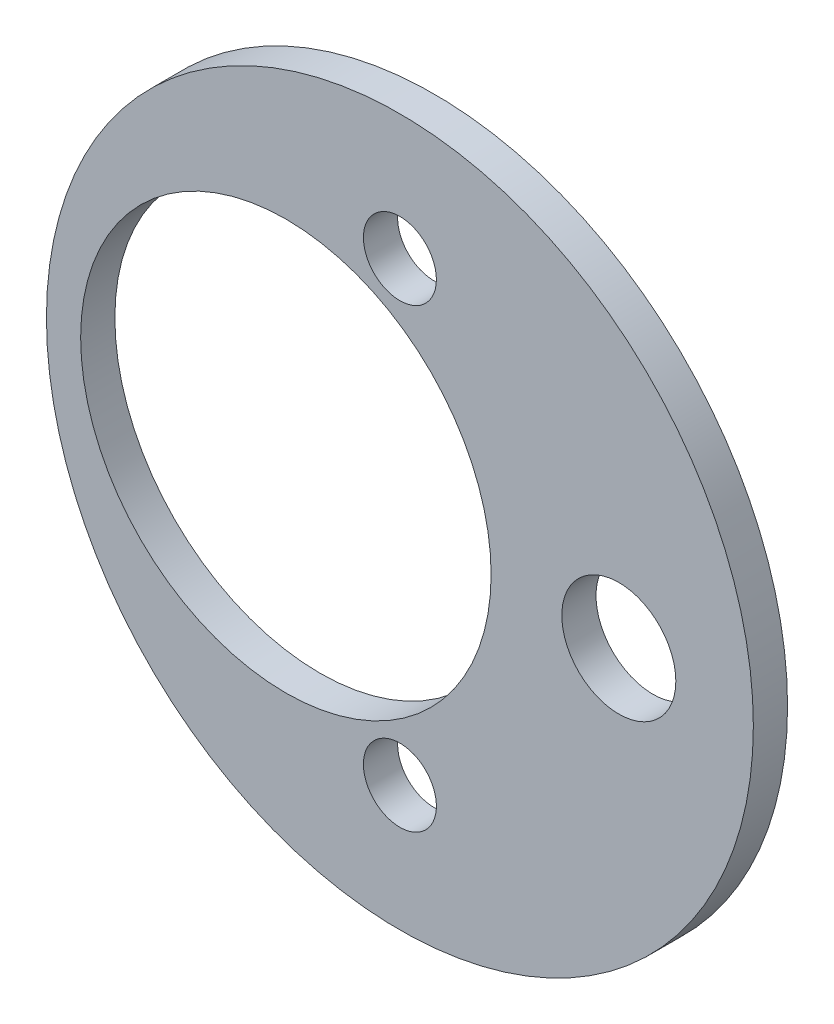
ISO-10303-21;
HEADER;
FILE_DESCRIPTION(('STEP AP214'),'2;1');
FILE_NAME('part.step','',(''),(''),'','','');
FILE_SCHEMA(('AUTOMOTIVE_DESIGN { 1 0 10303 214 1 1 1 1 }'));
ENDSEC;
DATA;
#1=APPLICATION_CONTEXT('core data for automotive mechanical design processes');
#2=APPLICATION_PROTOCOL_DEFINITION('international standard','automotive_design',2000,#1);
#3=PRODUCT_CONTEXT('',#1,'mechanical');
#4=PRODUCT('Part','Part','',(#3));
#5=PRODUCT_RELATED_PRODUCT_CATEGORY('part','',(#4));
#6=PRODUCT_DEFINITION_FORMATION('','',#4);
#7=PRODUCT_DEFINITION_CONTEXT('part definition',#1,'design');
#8=PRODUCT_DEFINITION('design','',#6,#7);
#9=PRODUCT_DEFINITION_SHAPE('','',#8);
#10=(LENGTH_UNIT() NAMED_UNIT(*) SI_UNIT(.MILLI.,.METRE.));
#11=(NAMED_UNIT(*) PLANE_ANGLE_UNIT() SI_UNIT($,.RADIAN.));
#12=(NAMED_UNIT(*) SI_UNIT($,.STERADIAN.) SOLID_ANGLE_UNIT());
#13=UNCERTAINTY_MEASURE_WITH_UNIT(LENGTH_MEASURE(1.E-05),#10,'distance_accuracy_value','');
#14=(GEOMETRIC_REPRESENTATION_CONTEXT(3) GLOBAL_UNCERTAINTY_ASSIGNED_CONTEXT((#13)) GLOBAL_UNIT_ASSIGNED_CONTEXT((#10,
#11,#12)) REPRESENTATION_CONTEXT('',''));
#15=CARTESIAN_POINT('',(0.,0.,0.));
#16=DIRECTION('',(0.,0.,1.));
#17=DIRECTION('',(1.,0.,0.));
#18=AXIS2_PLACEMENT_3D('',#15,#16,#17);
#19=CARTESIAN_POINT('',(0.,0.,1.5));
#20=DIRECTION('',(0.,0.,1.));
#21=DIRECTION('',(1.,0.,0.));
#22=AXIS2_PLACEMENT_3D('',#19,#20,#21);
#23=PLANE('',#22);
#24=CARTESIAN_POINT('',(0.,10.,1.5));
#25=DIRECTION('',(0.,0.,1.));
#26=DIRECTION('',(1.,0.,0.));
#27=AXIS2_PLACEMENT_3D('',#24,#25,#26);
#28=CIRCLE('',#27,1.6);
#29=CARTESIAN_POINT('',(1.6,10.,1.5));
#30=VERTEX_POINT('',#29);
#31=EDGE_CURVE('E59',#30,#30,#28,.T.);
#32=ORIENTED_EDGE('',*,*,#31,.F.);
#33=EDGE_LOOP('',(#32));
#34=FACE_BOUND('',#33,.T.);
#35=CARTESIAN_POINT('',(-5.,0.,1.5));
#36=DIRECTION('',(0.,0.,1.));
#37=DIRECTION('',(1.,0.,0.));
#38=AXIS2_PLACEMENT_3D('',#35,#36,#37);
#39=CIRCLE('',#38,9.);
#40=CARTESIAN_POINT('',(4.,0.,1.5));
#41=VERTEX_POINT('',#40);
#42=EDGE_CURVE('E48',#41,#41,#39,.T.);
#43=ORIENTED_EDGE('',*,*,#42,.F.);
#44=EDGE_LOOP('',(#43));
#45=FACE_BOUND('',#44,.T.);
#46=CARTESIAN_POINT('',(0.,0.,1.5));
#47=DIRECTION('',(0.,0.,1.));
#48=DIRECTION('',(1.,0.,0.));
#49=AXIS2_PLACEMENT_3D('',#46,#47,#48);
#50=CIRCLE('',#49,15.5);
#51=CARTESIAN_POINT('',(15.5,0.,1.5));
#52=VERTEX_POINT('',#51);
#53=EDGE_CURVE('E10',#52,#52,#50,.T.);
#54=ORIENTED_EDGE('',*,*,#53,.T.);
#55=EDGE_LOOP('',(#54));
#56=FACE_BOUND('',#55,.T.);
#57=CARTESIAN_POINT('',(9.6,0.,1.5));
#58=DIRECTION('',(0.,0.,1.));
#59=DIRECTION('',(1.,0.,0.));
#60=AXIS2_PLACEMENT_3D('',#57,#58,#59);
#61=CIRCLE('',#60,2.5);
#62=CARTESIAN_POINT('',(12.1,0.,1.5));
#63=VERTEX_POINT('',#62);
#64=EDGE_CURVE('E53',#63,#63,#61,.T.);
#65=ORIENTED_EDGE('',*,*,#64,.F.);
#66=EDGE_LOOP('',(#65));
#67=FACE_BOUND('',#66,.T.);
#68=CARTESIAN_POINT('',(0.,-10.,1.5));
#69=DIRECTION('',(0.,0.,1.));
#70=DIRECTION('',(-1.,0.,0.));
#71=AXIS2_PLACEMENT_3D('',#68,#69,#70);
#72=CIRCLE('',#71,1.6);
#73=CARTESIAN_POINT('',(-1.6,-10.,1.5));
#74=VERTEX_POINT('',#73);
#75=EDGE_CURVE('E65',#74,#74,#72,.T.);
#76=ORIENTED_EDGE('',*,*,#75,.F.);
#77=EDGE_LOOP('',(#76));
#78=FACE_BOUND('',#77,.T.);
#79=ADVANCED_FACE('F37',(#34,#45,#56,#67,#78),#23,.T.);
#80=CARTESIAN_POINT('',(0.,0.,0.));
#81=DIRECTION('',(0.,0.,1.));
#82=DIRECTION('',(1.,0.,0.));
#83=AXIS2_PLACEMENT_3D('',#80,#81,#82);
#84=PLANE('',#83);
#85=CARTESIAN_POINT('',(0.,0.,0.));
#86=DIRECTION('',(0.,0.,1.));
#87=DIRECTION('',(1.,0.,0.));
#88=AXIS2_PLACEMENT_3D('',#85,#86,#87);
#89=CIRCLE('',#88,15.5);
#90=CARTESIAN_POINT('',(15.5,0.,0.));
#91=VERTEX_POINT('',#90);
#92=EDGE_CURVE('E41',#91,#91,#89,.T.);
#93=ORIENTED_EDGE('',*,*,#92,.F.);
#94=EDGE_LOOP('',(#93));
#95=FACE_BOUND('',#94,.T.);
#96=CARTESIAN_POINT('',(-5.,0.,0.));
#97=DIRECTION('',(0.,0.,1.));
#98=DIRECTION('',(1.,0.,0.));
#99=AXIS2_PLACEMENT_3D('',#96,#97,#98);
#100=CIRCLE('',#99,9.);
#101=CARTESIAN_POINT('',(4.,0.,0.));
#102=VERTEX_POINT('',#101);
#103=EDGE_CURVE('E50',#102,#102,#100,.T.);
#104=ORIENTED_EDGE('',*,*,#103,.T.);
#105=EDGE_LOOP('',(#104));
#106=FACE_BOUND('',#105,.T.);
#107=CARTESIAN_POINT('',(9.6,0.,0.));
#108=DIRECTION('',(0.,0.,1.));
#109=DIRECTION('',(1.,0.,0.));
#110=AXIS2_PLACEMENT_3D('',#107,#108,#109);
#111=CIRCLE('',#110,2.5);
#112=CARTESIAN_POINT('',(12.1,0.,0.));
#113=VERTEX_POINT('',#112);
#114=EDGE_CURVE('E56',#113,#113,#111,.T.);
#115=ORIENTED_EDGE('',*,*,#114,.T.);
#116=EDGE_LOOP('',(#115));
#117=FACE_BOUND('',#116,.T.);
#118=CARTESIAN_POINT('',(0.,10.,0.));
#119=DIRECTION('',(0.,0.,1.));
#120=DIRECTION('',(1.,0.,0.));
#121=AXIS2_PLACEMENT_3D('',#118,#119,#120);
#122=CIRCLE('',#121,1.6);
#123=CARTESIAN_POINT('',(1.6,10.,0.));
#124=VERTEX_POINT('',#123);
#125=EDGE_CURVE('E62',#124,#124,#122,.T.);
#126=ORIENTED_EDGE('',*,*,#125,.T.);
#127=EDGE_LOOP('',(#126));
#128=FACE_BOUND('',#127,.T.);
#129=CARTESIAN_POINT('',(0.,-10.,0.));
#130=DIRECTION('',(0.,0.,1.));
#131=DIRECTION('',(-1.,0.,0.));
#132=AXIS2_PLACEMENT_3D('',#129,#130,#131);
#133=CIRCLE('',#132,1.6);
#134=CARTESIAN_POINT('',(-1.6,-10.,0.));
#135=VERTEX_POINT('',#134);
#136=EDGE_CURVE('E68',#135,#135,#133,.T.);
#137=ORIENTED_EDGE('',*,*,#136,.T.);
#138=EDGE_LOOP('',(#137));
#139=FACE_BOUND('',#138,.T.);
#140=ADVANCED_FACE('F78',(#95,#106,#117,#128,#139),#84,.F.);
#141=CARTESIAN_POINT('',(0.,0.,1.5));
#142=DIRECTION('',(0.,0.,-1.));
#143=DIRECTION('',(-1.,0.,0.));
#144=AXIS2_PLACEMENT_3D('',#141,#142,#143);
#145=CYLINDRICAL_SURFACE('',#144,15.5);
#146=ORIENTED_EDGE('',*,*,#53,.F.);
#147=EDGE_LOOP('',(#146));
#148=FACE_BOUND('',#147,.T.);
#149=ORIENTED_EDGE('',*,*,#92,.T.);
#150=EDGE_LOOP('',(#149));
#151=FACE_BOUND('',#150,.T.);
#152=ADVANCED_FACE('F39',(#148,#151),#145,.T.);
#153=CARTESIAN_POINT('',(-5.,0.,1.5));
#154=DIRECTION('',(0.,0.,-1.));
#155=DIRECTION('',(-1.,0.,0.));
#156=AXIS2_PLACEMENT_3D('',#153,#154,#155);
#157=CYLINDRICAL_SURFACE('',#156,9.);
#158=ORIENTED_EDGE('',*,*,#42,.T.);
#159=EDGE_LOOP('',(#158));
#160=FACE_BOUND('',#159,.T.);
#161=ORIENTED_EDGE('',*,*,#103,.F.);
#162=EDGE_LOOP('',(#161));
#163=FACE_BOUND('',#162,.T.);
#164=ADVANCED_FACE('F88',(#160,#163),#157,.F.);
#165=CARTESIAN_POINT('',(9.6,0.,1.5));
#166=DIRECTION('',(0.,0.,-1.));
#167=DIRECTION('',(-1.,0.,0.));
#168=AXIS2_PLACEMENT_3D('',#165,#166,#167);
#169=CYLINDRICAL_SURFACE('',#168,2.5);
#170=ORIENTED_EDGE('',*,*,#64,.T.);
#171=EDGE_LOOP('',(#170));
#172=FACE_BOUND('',#171,.T.);
#173=ORIENTED_EDGE('',*,*,#114,.F.);
#174=EDGE_LOOP('',(#173));
#175=FACE_BOUND('',#174,.T.);
#176=ADVANCED_FACE('F91',(#172,#175),#169,.F.);
#177=CARTESIAN_POINT('',(0.,10.,1.5));
#178=DIRECTION('',(0.,0.,-1.));
#179=DIRECTION('',(-1.,0.,0.));
#180=AXIS2_PLACEMENT_3D('',#177,#178,#179);
#181=CYLINDRICAL_SURFACE('',#180,1.6);
#182=ORIENTED_EDGE('',*,*,#31,.T.);
#183=EDGE_LOOP('',(#182));
#184=FACE_BOUND('',#183,.T.);
#185=ORIENTED_EDGE('',*,*,#125,.F.);
#186=EDGE_LOOP('',(#185));
#187=FACE_BOUND('',#186,.T.);
#188=ADVANCED_FACE('F95',(#184,#187),#181,.F.);
#189=CARTESIAN_POINT('',(0.,-10.,1.5));
#190=DIRECTION('',(0.,0.,-1.));
#191=DIRECTION('',(-1.,0.,0.));
#192=AXIS2_PLACEMENT_3D('',#189,#190,#191);
#193=CYLINDRICAL_SURFACE('',#192,1.6);
#194=ORIENTED_EDGE('',*,*,#75,.T.);
#195=EDGE_LOOP('',(#194));
#196=FACE_BOUND('',#195,.T.);
#197=ORIENTED_EDGE('',*,*,#136,.F.);
#198=EDGE_LOOP('',(#197));
#199=FACE_BOUND('',#198,.T.);
#200=ADVANCED_FACE('F74',(#196,#199),#193,.F.);
#201=CLOSED_SHELL('',(#79,#140,#152,#164,#176,#188,#200));
#202=MANIFOLD_SOLID_BREP('B2',#201);
#203=ADVANCED_BREP_SHAPE_REPRESENTATION('',(#18,#202),#14);
#204=SHAPE_DEFINITION_REPRESENTATION(#9,#203);
ENDSEC;
END-ISO-10303-21;
